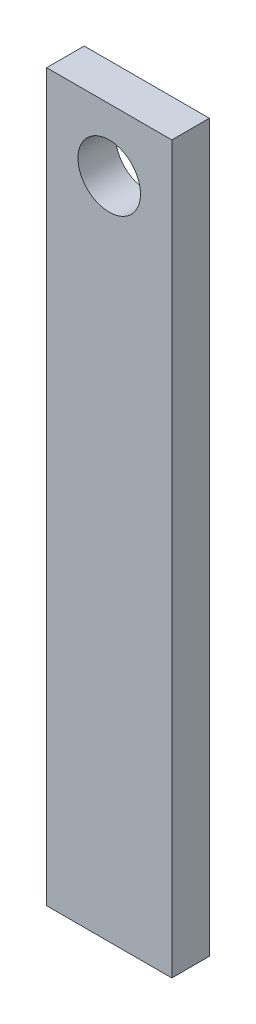
ISO-10303-21;
HEADER;
FILE_DESCRIPTION(('STEP AP214'),'2;1');
FILE_NAME('part.step','',(''),(''),'','','');
FILE_SCHEMA(('AUTOMOTIVE_DESIGN { 1 0 10303 214 1 1 1 1 }'));
ENDSEC;
DATA;
#1=APPLICATION_CONTEXT('core data for automotive mechanical design processes');
#2=APPLICATION_PROTOCOL_DEFINITION('international standard','automotive_design',2000,#1);
#3=PRODUCT_CONTEXT('',#1,'mechanical');
#4=PRODUCT('Part','Part','',(#3));
#5=PRODUCT_RELATED_PRODUCT_CATEGORY('part','',(#4));
#6=PRODUCT_DEFINITION_FORMATION('','',#4);
#7=PRODUCT_DEFINITION_CONTEXT('part definition',#1,'design');
#8=PRODUCT_DEFINITION('design','',#6,#7);
#9=PRODUCT_DEFINITION_SHAPE('','',#8);
#10=(LENGTH_UNIT() NAMED_UNIT(*) SI_UNIT(.MILLI.,.METRE.));
#11=(NAMED_UNIT(*) PLANE_ANGLE_UNIT() SI_UNIT($,.RADIAN.));
#12=(NAMED_UNIT(*) SI_UNIT($,.STERADIAN.) SOLID_ANGLE_UNIT());
#13=UNCERTAINTY_MEASURE_WITH_UNIT(LENGTH_MEASURE(1.E-05),#10,'distance_accuracy_value','');
#14=(GEOMETRIC_REPRESENTATION_CONTEXT(3) GLOBAL_UNCERTAINTY_ASSIGNED_CONTEXT((#13)) GLOBAL_UNIT_ASSIGNED_CONTEXT((#10,
#11,#12)) REPRESENTATION_CONTEXT('',''));
#15=CARTESIAN_POINT('',(0.,0.,0.));
#16=DIRECTION('',(0.,0.,1.));
#17=DIRECTION('',(1.,0.,0.));
#18=AXIS2_PLACEMENT_3D('',#15,#16,#17);
#19=CARTESIAN_POINT('',(0.,0.,3.));
#20=DIRECTION('',(0.,0.,-1.));
#21=DIRECTION('',(-1.,0.,0.));
#22=AXIS2_PLACEMENT_3D('',#19,#20,#21);
#23=PLANE('',#22);
#24=DIRECTION('',(0.,1.,0.));
#25=VECTOR('',#24,1.);
#26=CARTESIAN_POINT('',(5.,-29.,3.));
#27=LINE('',#26,#25);
#28=CARTESIAN_POINT('',(5.,-29.,3.));
#29=VERTEX_POINT('',#28);
#30=CARTESIAN_POINT('',(5.,29.,3.));
#31=VERTEX_POINT('',#30);
#32=EDGE_CURVE('E85',#29,#31,#27,.T.);
#33=ORIENTED_EDGE('',*,*,#32,.T.);
#34=DIRECTION('',(-1.,0.,0.));
#35=VECTOR('',#34,1.);
#36=CARTESIAN_POINT('',(-5.,29.,3.));
#37=LINE('',#36,#35);
#38=CARTESIAN_POINT('',(-5.,29.,3.));
#39=VERTEX_POINT('',#38);
#40=EDGE_CURVE('E80',#31,#39,#37,.T.);
#41=ORIENTED_EDGE('',*,*,#40,.T.);
#42=DIRECTION('',(0.,-1.,0.));
#43=VECTOR('',#42,1.);
#44=CARTESIAN_POINT('',(-5.,-29.,3.));
#45=LINE('',#44,#43);
#46=CARTESIAN_POINT('',(-5.,-29.,3.));
#47=VERTEX_POINT('',#46);
#48=EDGE_CURVE('E83',#39,#47,#45,.T.);
#49=ORIENTED_EDGE('',*,*,#48,.T.);
#50=DIRECTION('',(1.,0.,0.));
#51=VECTOR('',#50,1.);
#52=CARTESIAN_POINT('',(-5.,-29.,3.));
#53=LINE('',#52,#51);
#54=EDGE_CURVE('E50',#47,#29,#53,.T.);
#55=ORIENTED_EDGE('',*,*,#54,.T.);
#56=EDGE_LOOP('',(#33,#41,#49,#55));
#57=FACE_BOUND('',#56,.T.);
#58=CARTESIAN_POINT('',(0.,24.,3.));
#59=DIRECTION('',(0.,0.,1.));
#60=DIRECTION('',(1.,0.,0.));
#61=AXIS2_PLACEMENT_3D('',#58,#59,#60);
#62=CIRCLE('',#61,2.5);
#63=CARTESIAN_POINT('',(2.5,24.,3.));
#64=VERTEX_POINT('',#63);
#65=EDGE_CURVE('E100',#64,#64,#62,.T.);
#66=ORIENTED_EDGE('',*,*,#65,.F.);
#67=EDGE_LOOP('',(#66));
#68=FACE_BOUND('',#67,.T.);
#69=ADVANCED_FACE('F33',(#57,#68),#23,.F.);
#70=CARTESIAN_POINT('',(0.,0.,0.));
#71=DIRECTION('',(0.,0.,-1.));
#72=DIRECTION('',(-1.,0.,0.));
#73=AXIS2_PLACEMENT_3D('',#70,#71,#72);
#74=PLANE('',#73);
#75=DIRECTION('',(0.,1.,0.));
#76=VECTOR('',#75,1.);
#77=CARTESIAN_POINT('',(5.,-29.,0.));
#78=LINE('',#77,#76);
#79=CARTESIAN_POINT('',(5.,-29.,0.));
#80=VERTEX_POINT('',#79);
#81=CARTESIAN_POINT('',(5.,29.,0.));
#82=VERTEX_POINT('',#81);
#83=EDGE_CURVE('E97',#80,#82,#78,.T.);
#84=ORIENTED_EDGE('',*,*,#83,.F.);
#85=DIRECTION('',(1.,0.,0.));
#86=VECTOR('',#85,1.);
#87=CARTESIAN_POINT('',(-5.,-29.,0.));
#88=LINE('',#87,#86);
#89=CARTESIAN_POINT('',(-5.,-29.,0.));
#90=VERTEX_POINT('',#89);
#91=EDGE_CURVE('E73',#90,#80,#88,.T.);
#92=ORIENTED_EDGE('',*,*,#91,.F.);
#93=DIRECTION('',(0.,-1.,0.));
#94=VECTOR('',#93,1.);
#95=CARTESIAN_POINT('',(-5.,-29.,0.));
#96=LINE('',#95,#94);
#97=CARTESIAN_POINT('',(-5.,29.,0.));
#98=VERTEX_POINT('',#97);
#99=EDGE_CURVE('E67',#98,#90,#96,.T.);
#100=ORIENTED_EDGE('',*,*,#99,.F.);
#101=DIRECTION('',(-1.,0.,0.));
#102=VECTOR('',#101,1.);
#103=CARTESIAN_POINT('',(-5.,29.,0.));
#104=LINE('',#103,#102);
#105=EDGE_CURVE('E89',#82,#98,#104,.T.);
#106=ORIENTED_EDGE('',*,*,#105,.F.);
#107=EDGE_LOOP('',(#84,#92,#100,#106));
#108=FACE_BOUND('',#107,.T.);
#109=CARTESIAN_POINT('',(0.,24.,0.));
#110=DIRECTION('',(0.,0.,1.));
#111=DIRECTION('',(1.,0.,0.));
#112=AXIS2_PLACEMENT_3D('',#109,#110,#111);
#113=CIRCLE('',#112,2.5);
#114=CARTESIAN_POINT('',(2.5,24.,0.));
#115=VERTEX_POINT('',#114);
#116=EDGE_CURVE('E112',#115,#115,#113,.T.);
#117=ORIENTED_EDGE('',*,*,#116,.T.);
#118=EDGE_LOOP('',(#117));
#119=FACE_BOUND('',#118,.T.);
#120=ADVANCED_FACE('F108',(#108,#119),#74,.T.);
#121=CARTESIAN_POINT('',(5.,-29.,3.));
#122=DIRECTION('',(-1.,0.,0.));
#123=DIRECTION('',(0.,0.,1.));
#124=AXIS2_PLACEMENT_3D('',#121,#122,#123);
#125=PLANE('',#124);
#126=ORIENTED_EDGE('',*,*,#83,.T.);
#127=DIRECTION('',(0.,0.,-1.));
#128=VECTOR('',#127,1.);
#129=CARTESIAN_POINT('',(5.,29.,3.));
#130=LINE('',#129,#128);
#131=EDGE_CURVE('E11',#31,#82,#130,.T.);
#132=ORIENTED_EDGE('',*,*,#131,.F.);
#133=ORIENTED_EDGE('',*,*,#32,.F.);
#134=DIRECTION('',(0.,0.,-1.));
#135=VECTOR('',#134,1.);
#136=CARTESIAN_POINT('',(5.,-29.,3.));
#137=LINE('',#136,#135);
#138=EDGE_CURVE('E93',#29,#80,#137,.T.);
#139=ORIENTED_EDGE('',*,*,#138,.T.);
#140=EDGE_LOOP('',(#126,#132,#133,#139));
#141=FACE_BOUND('',#140,.T.);
#142=ADVANCED_FACE('F35',(#141),#125,.F.);
#143=CARTESIAN_POINT('',(-5.,29.,3.));
#144=DIRECTION('',(0.,-1.,0.));
#145=DIRECTION('',(0.,0.,-1.));
#146=AXIS2_PLACEMENT_3D('',#143,#144,#145);
#147=PLANE('',#146);
#148=ORIENTED_EDGE('',*,*,#105,.T.);
#149=DIRECTION('',(0.,0.,-1.));
#150=VECTOR('',#149,1.);
#151=CARTESIAN_POINT('',(-5.,29.,3.));
#152=LINE('',#151,#150);
#153=EDGE_CURVE('E42',#39,#98,#152,.T.);
#154=ORIENTED_EDGE('',*,*,#153,.F.);
#155=ORIENTED_EDGE('',*,*,#40,.F.);
#156=ORIENTED_EDGE('',*,*,#131,.T.);
#157=EDGE_LOOP('',(#148,#154,#155,#156));
#158=FACE_BOUND('',#157,.T.);
#159=ADVANCED_FACE('F88',(#158),#147,.F.);
#160=CARTESIAN_POINT('',(-5.,-29.,3.));
#161=DIRECTION('',(1.,0.,0.));
#162=DIRECTION('',(0.,0.,-1.));
#163=AXIS2_PLACEMENT_3D('',#160,#161,#162);
#164=PLANE('',#163);
#165=ORIENTED_EDGE('',*,*,#99,.T.);
#166=DIRECTION('',(0.,0.,-1.));
#167=VECTOR('',#166,1.);
#168=CARTESIAN_POINT('',(-5.,-29.,3.));
#169=LINE('',#168,#167);
#170=EDGE_CURVE('E90',#47,#90,#169,.T.);
#171=ORIENTED_EDGE('',*,*,#170,.F.);
#172=ORIENTED_EDGE('',*,*,#48,.F.);
#173=ORIENTED_EDGE('',*,*,#153,.T.);
#174=EDGE_LOOP('',(#165,#171,#172,#173));
#175=FACE_BOUND('',#174,.T.);
#176=ADVANCED_FACE('F91',(#175),#164,.F.);
#177=CARTESIAN_POINT('',(-5.,-29.,3.));
#178=DIRECTION('',(0.,1.,0.));
#179=DIRECTION('',(0.,0.,1.));
#180=AXIS2_PLACEMENT_3D('',#177,#178,#179);
#181=PLANE('',#180);
#182=ORIENTED_EDGE('',*,*,#91,.T.);
#183=ORIENTED_EDGE('',*,*,#138,.F.);
#184=ORIENTED_EDGE('',*,*,#54,.F.);
#185=ORIENTED_EDGE('',*,*,#170,.T.);
#186=EDGE_LOOP('',(#182,#183,#184,#185));
#187=FACE_BOUND('',#186,.T.);
#188=ADVANCED_FACE('F105',(#187),#181,.F.);
#189=CARTESIAN_POINT('',(0.,24.,3.));
#190=DIRECTION('',(0.,0.,-1.));
#191=DIRECTION('',(-1.,0.,0.));
#192=AXIS2_PLACEMENT_3D('',#189,#190,#191);
#193=CYLINDRICAL_SURFACE('',#192,2.5);
#194=ORIENTED_EDGE('',*,*,#65,.T.);
#195=EDGE_LOOP('',(#194));
#196=FACE_BOUND('',#195,.T.);
#197=ORIENTED_EDGE('',*,*,#116,.F.);
#198=EDGE_LOOP('',(#197));
#199=FACE_BOUND('',#198,.T.);
#200=ADVANCED_FACE('F118',(#196,#199),#193,.F.);
#201=CLOSED_SHELL('',(#69,#120,#142,#159,#176,#188,#200));
#202=MANIFOLD_SOLID_BREP('B2',#201);
#203=ADVANCED_BREP_SHAPE_REPRESENTATION('',(#18,#202),#14);
#204=SHAPE_DEFINITION_REPRESENTATION(#9,#203);
ENDSEC;
END-ISO-10303-21;
